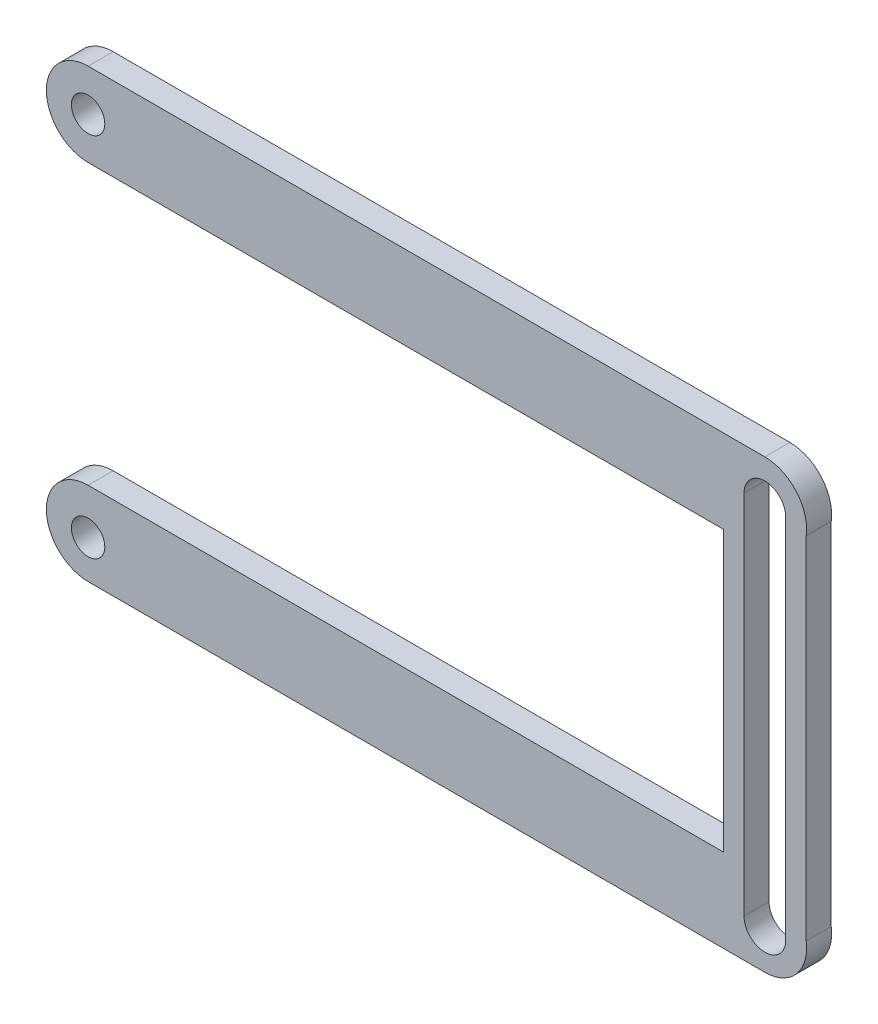
ISO-10303-21;
HEADER;
FILE_DESCRIPTION(('STEP AP214'),'2;1');
FILE_NAME('part.step','',(''),(''),'','','');
FILE_SCHEMA(('AUTOMOTIVE_DESIGN { 1 0 10303 214 1 1 1 1 }'));
ENDSEC;
DATA;
#1=APPLICATION_CONTEXT('core data for automotive mechanical design processes');
#2=APPLICATION_PROTOCOL_DEFINITION('international standard','automotive_design',2000,#1);
#3=PRODUCT_CONTEXT('',#1,'mechanical');
#4=PRODUCT('Part','Part','',(#3));
#5=PRODUCT_RELATED_PRODUCT_CATEGORY('part','',(#4));
#6=PRODUCT_DEFINITION_FORMATION('','',#4);
#7=PRODUCT_DEFINITION_CONTEXT('part definition',#1,'design');
#8=PRODUCT_DEFINITION('design','',#6,#7);
#9=PRODUCT_DEFINITION_SHAPE('','',#8);
#10=(LENGTH_UNIT() NAMED_UNIT(*) SI_UNIT(.MILLI.,.METRE.));
#11=(NAMED_UNIT(*) PLANE_ANGLE_UNIT() SI_UNIT($,.RADIAN.));
#12=(NAMED_UNIT(*) SI_UNIT($,.STERADIAN.) SOLID_ANGLE_UNIT());
#13=UNCERTAINTY_MEASURE_WITH_UNIT(LENGTH_MEASURE(1.E-05),#10,'distance_accuracy_value','');
#14=(GEOMETRIC_REPRESENTATION_CONTEXT(3) GLOBAL_UNCERTAINTY_ASSIGNED_CONTEXT((#13)) GLOBAL_UNIT_ASSIGNED_CONTEXT((#10,
#11,#12)) REPRESENTATION_CONTEXT('',''));
#15=CARTESIAN_POINT('',(0.,0.,0.));
#16=DIRECTION('',(0.,0.,1.));
#17=DIRECTION('',(1.,0.,0.));
#18=AXIS2_PLACEMENT_3D('',#15,#16,#17);
#19=CARTESIAN_POINT('',(0.,14.910133645233,-3.));
#20=DIRECTION('',(0.,-1.,0.));
#21=DIRECTION('',(0.,0.,-1.));
#22=AXIS2_PLACEMENT_3D('',#19,#20,#21);
#23=PLANE('',#22);
#24=DIRECTION('',(1.,0.,0.));
#25=VECTOR('',#24,1.);
#26=CARTESIAN_POINT('',(0.,14.910133645233,0.));
#27=LINE('',#26,#25);
#28=CARTESIAN_POINT('',(-50.3363952262952,14.910133645233,0.));
#29=VERTEX_POINT('',#28);
#30=CARTESIAN_POINT('',(25.802071197867,14.910133645233,0.));
#31=VERTEX_POINT('',#30);
#32=EDGE_CURVE('E240',#29,#31,#27,.T.);
#33=ORIENTED_EDGE('',*,*,#32,.F.);
#34=DIRECTION('',(0.,0.,1.));
#35=VECTOR('',#34,1.);
#36=CARTESIAN_POINT('',(-50.3363952262952,14.910133645233,-3.));
#37=LINE('',#36,#35);
#38=CARTESIAN_POINT('',(-50.3363952262952,14.910133645233,-3.));
#39=VERTEX_POINT('',#38);
#40=EDGE_CURVE('E270',#39,#29,#37,.T.);
#41=ORIENTED_EDGE('',*,*,#40,.F.);
#42=DIRECTION('',(1.,0.,0.));
#43=VECTOR('',#42,1.);
#44=CARTESIAN_POINT('',(0.,14.910133645233,-3.));
#45=LINE('',#44,#43);
#46=CARTESIAN_POINT('',(25.802071197867,14.910133645233,-3.));
#47=VERTEX_POINT('',#46);
#48=EDGE_CURVE('E244',#39,#47,#45,.T.);
#49=ORIENTED_EDGE('',*,*,#48,.T.);
#50=DIRECTION('',(0.,0.,1.));
#51=VECTOR('',#50,1.);
#52=CARTESIAN_POINT('',(25.802071197867,14.910133645233,-3.));
#53=LINE('',#52,#51);
#54=EDGE_CURVE('E263',#47,#31,#53,.T.);
#55=ORIENTED_EDGE('',*,*,#54,.T.);
#56=EDGE_LOOP('',(#33,#41,#49,#55));
#57=FACE_BOUND('',#56,.T.);
#58=ADVANCED_FACE('F99',(#57),#23,.T.);
#59=CARTESIAN_POINT('',(-50.3363952262952,19.910133645233,-3.));
#60=DIRECTION('',(0.,0.,1.));
#61=DIRECTION('',(1.,0.,0.));
#62=AXIS2_PLACEMENT_3D('',#59,#60,#61);
#63=CYLINDRICAL_SURFACE('',#62,5.);
#64=CARTESIAN_POINT('',(-50.3363952262952,19.910133645233,0.));
#65=DIRECTION('',(0.,0.,1.));
#66=DIRECTION('',(1.,0.,0.));
#67=AXIS2_PLACEMENT_3D('',#64,#65,#66);
#68=CIRCLE('',#67,5.);
#69=CARTESIAN_POINT('',(-50.3363952262952,24.910133645233,0.));
#70=VERTEX_POINT('',#69);
#71=EDGE_CURVE('E258',#70,#29,#68,.T.);
#72=ORIENTED_EDGE('',*,*,#71,.F.);
#73=DIRECTION('',(0.,0.,1.));
#74=VECTOR('',#73,1.);
#75=CARTESIAN_POINT('',(-50.3363952262952,24.910133645233,-3.));
#76=LINE('',#75,#74);
#77=CARTESIAN_POINT('',(-50.3363952262952,24.910133645233,-3.));
#78=VERTEX_POINT('',#77);
#79=EDGE_CURVE('E267',#78,#70,#76,.T.);
#80=ORIENTED_EDGE('',*,*,#79,.F.);
#81=CARTESIAN_POINT('',(-50.3363952262952,19.910133645233,-3.));
#82=DIRECTION('',(0.,0.,1.));
#83=DIRECTION('',(1.,0.,0.));
#84=AXIS2_PLACEMENT_3D('',#81,#82,#83);
#85=CIRCLE('',#84,5.);
#86=EDGE_CURVE('E245',#78,#39,#85,.T.);
#87=ORIENTED_EDGE('',*,*,#86,.T.);
#88=ORIENTED_EDGE('',*,*,#40,.T.);
#89=EDGE_LOOP('',(#72,#80,#87,#88));
#90=FACE_BOUND('',#89,.T.);
#91=ADVANCED_FACE('F362',(#90),#63,.T.);
#92=CARTESIAN_POINT('',(0.,24.910133645233,-3.));
#93=DIRECTION('',(0.,-1.,0.));
#94=DIRECTION('',(0.,0.,-1.));
#95=AXIS2_PLACEMENT_3D('',#92,#93,#94);
#96=PLANE('',#95);
#97=DIRECTION('',(1.,0.,0.));
#98=VECTOR('',#97,1.);
#99=CARTESIAN_POINT('',(0.,24.910133645233,0.));
#100=LINE('',#99,#98);
#101=CARTESIAN_POINT('',(30.7502492238458,24.910133645233,0.));
#102=VERTEX_POINT('',#101);
#103=EDGE_CURVE('E259',#70,#102,#100,.T.);
#104=ORIENTED_EDGE('',*,*,#103,.T.);
#105=DIRECTION('',(0.,0.,1.));
#106=VECTOR('',#105,1.);
#107=CARTESIAN_POINT('',(30.7502492238458,24.910133645233,-3.));
#108=LINE('',#107,#106);
#109=CARTESIAN_POINT('',(30.7502492238458,24.910133645233,-3.));
#110=VERTEX_POINT('',#109);
#111=EDGE_CURVE('E272',#110,#102,#108,.T.);
#112=ORIENTED_EDGE('',*,*,#111,.F.);
#113=DIRECTION('',(1.,0.,0.));
#114=VECTOR('',#113,1.);
#115=CARTESIAN_POINT('',(0.,24.910133645233,-3.));
#116=LINE('',#115,#114);
#117=EDGE_CURVE('E239',#78,#110,#116,.T.);
#118=ORIENTED_EDGE('',*,*,#117,.F.);
#119=ORIENTED_EDGE('',*,*,#79,.T.);
#120=EDGE_LOOP('',(#104,#112,#118,#119));
#121=FACE_BOUND('',#120,.T.);
#122=ADVANCED_FACE('F371',(#121),#96,.F.);
#123=CARTESIAN_POINT('',(30.7502492238458,19.910133645233,-3.));
#124=DIRECTION('',(0.,0.,1.));
#125=DIRECTION('',(1.,0.,0.));
#126=AXIS2_PLACEMENT_3D('',#123,#124,#125);
#127=CYLINDRICAL_SURFACE('',#126,5.);
#128=CARTESIAN_POINT('',(30.7502492238458,19.910133645233,0.));
#129=DIRECTION('',(0.,0.,1.));
#130=DIRECTION('',(1.,0.,0.));
#131=AXIS2_PLACEMENT_3D('',#128,#129,#130);
#132=CIRCLE('',#131,5.);
#133=CARTESIAN_POINT('',(35.6984272498246,19.192126526034,0.));
#134=VERTEX_POINT('',#133);
#135=EDGE_CURVE('E255',#134,#102,#132,.T.);
#136=ORIENTED_EDGE('',*,*,#135,.F.);
#137=DIRECTION('',(0.,0.,1.));
#138=VECTOR('',#137,1.);
#139=CARTESIAN_POINT('',(35.6984272498246,19.192126526034,-3.));
#140=LINE('',#139,#138);
#141=CARTESIAN_POINT('',(35.6984272498246,19.192126526034,-3.));
#142=VERTEX_POINT('',#141);
#143=EDGE_CURVE('E247',#142,#134,#140,.T.);
#144=ORIENTED_EDGE('',*,*,#143,.F.);
#145=CARTESIAN_POINT('',(30.7502492238458,19.910133645233,-3.));
#146=DIRECTION('',(0.,0.,1.));
#147=DIRECTION('',(1.,0.,0.));
#148=AXIS2_PLACEMENT_3D('',#145,#146,#147);
#149=CIRCLE('',#148,5.);
#150=EDGE_CURVE('E236',#142,#110,#149,.T.);
#151=ORIENTED_EDGE('',*,*,#150,.T.);
#152=ORIENTED_EDGE('',*,*,#111,.T.);
#153=EDGE_LOOP('',(#136,#144,#151,#152));
#154=FACE_BOUND('',#153,.T.);
#155=ADVANCED_FACE('F378',(#154),#127,.T.);
#156=CARTESIAN_POINT('',(-50.3363952262952,19.910133645233,-3.));
#157=DIRECTION('',(0.,0.,1.));
#158=DIRECTION('',(1.,0.,0.));
#159=AXIS2_PLACEMENT_3D('',#156,#157,#158);
#160=CYLINDRICAL_SURFACE('',#159,2.);
#161=CARTESIAN_POINT('',(-50.3363952262952,19.910133645233,-3.));
#162=DIRECTION('',(0.,0.,1.));
#163=DIRECTION('',(1.,0.,0.));
#164=AXIS2_PLACEMENT_3D('',#161,#162,#163);
#165=CIRCLE('',#164,2.);
#166=CARTESIAN_POINT('',(-48.3363952262952,19.910133645233,-3.));
#167=VERTEX_POINT('',#166);
#168=EDGE_CURVE('E231',#167,#167,#165,.T.);
#169=ORIENTED_EDGE('',*,*,#168,.F.);
#170=EDGE_LOOP('',(#169));
#171=FACE_BOUND('',#170,.T.);
#172=CARTESIAN_POINT('',(-50.3363952262952,19.910133645233,0.));
#173=DIRECTION('',(0.,0.,1.));
#174=DIRECTION('',(1.,0.,0.));
#175=AXIS2_PLACEMENT_3D('',#172,#173,#174);
#176=CIRCLE('',#175,2.);
#177=CARTESIAN_POINT('',(-48.3363952262952,19.910133645233,0.));
#178=VERTEX_POINT('',#177);
#179=EDGE_CURVE('E248',#178,#178,#176,.T.);
#180=ORIENTED_EDGE('',*,*,#179,.T.);
#181=EDGE_LOOP('',(#180));
#182=FACE_BOUND('',#181,.T.);
#183=ADVANCED_FACE('F384',(#171,#182),#160,.F.);
#184=CARTESIAN_POINT('',(0.,0.,0.));
#185=DIRECTION('',(0.,0.,1.));
#186=DIRECTION('',(1.,0.,0.));
#187=AXIS2_PLACEMENT_3D('',#184,#185,#186);
#188=PLANE('',#187);
#189=CARTESIAN_POINT('',(30.7502492238458,19.910133645233,0.));
#190=DIRECTION('',(0.,0.,1.));
#191=DIRECTION('',(1.,0.,0.));
#192=AXIS2_PLACEMENT_3D('',#189,#190,#191);
#193=CIRCLE('',#192,2.49817802597881);
#194=CARTESIAN_POINT('',(33.2484272498246,19.910133645233,0.));
#195=VERTEX_POINT('',#194);
#196=CARTESIAN_POINT('',(28.252071197867,19.910133645233,0.));
#197=VERTEX_POINT('',#196);
#198=EDGE_CURVE('E114',#195,#197,#193,.T.);
#199=ORIENTED_EDGE('',*,*,#198,.F.);
#200=DIRECTION('',(0.,-1.,0.));
#201=VECTOR('',#200,1.);
#202=CARTESIAN_POINT('',(33.2484272498246,19.910133645233,0.));
#203=LINE('',#202,#201);
#204=CARTESIAN_POINT('',(33.2484272498246,-23.9914631118977,0.));
#205=VERTEX_POINT('',#204);
#206=EDGE_CURVE('E219',#195,#205,#203,.T.);
#207=ORIENTED_EDGE('',*,*,#206,.T.);
#208=CARTESIAN_POINT('',(30.7502492238458,-23.9914631118977,0.));
#209=DIRECTION('',(0.,0.,1.));
#210=DIRECTION('',(1.,0.,0.));
#211=AXIS2_PLACEMENT_3D('',#208,#209,#210);
#212=CIRCLE('',#211,2.49817802597881);
#213=CARTESIAN_POINT('',(28.252071197867,-23.9914631118977,0.));
#214=VERTEX_POINT('',#213);
#215=EDGE_CURVE('E202',#214,#205,#212,.T.);
#216=ORIENTED_EDGE('',*,*,#215,.F.);
#217=DIRECTION('',(0.,-1.,0.));
#218=VECTOR('',#217,1.);
#219=CARTESIAN_POINT('',(28.252071197867,19.910133645233,0.));
#220=LINE('',#219,#218);
#221=EDGE_CURVE('E215',#197,#214,#220,.T.);
#222=ORIENTED_EDGE('',*,*,#221,.F.);
#223=EDGE_LOOP('',(#199,#207,#216,#222));
#224=FACE_BOUND('',#223,.T.);
#225=CARTESIAN_POINT('',(-50.3363952262952,-23.9914631118977,0.));
#226=DIRECTION('',(0.,0.,1.));
#227=DIRECTION('',(1.,0.,0.));
#228=AXIS2_PLACEMENT_3D('',#225,#226,#227);
#229=CIRCLE('',#228,2.);
#230=CARTESIAN_POINT('',(-48.3363952262952,-23.9914631118977,0.));
#231=VERTEX_POINT('',#230);
#232=EDGE_CURVE('E227',#231,#231,#229,.T.);
#233=ORIENTED_EDGE('',*,*,#232,.F.);
#234=EDGE_LOOP('',(#233));
#235=FACE_BOUND('',#234,.T.);
#236=DIRECTION('',(0.,-1.,0.));
#237=VECTOR('',#236,1.);
#238=CARTESIAN_POINT('',(35.6984272498246,19.910133645233,0.));
#239=LINE('',#238,#237);
#240=CARTESIAN_POINT('',(35.6984272498246,-22.8570733444997,0.));
#241=VERTEX_POINT('',#240);
#242=EDGE_CURVE('E308',#134,#241,#239,.T.);
#243=ORIENTED_EDGE('',*,*,#242,.F.);
#244=ORIENTED_EDGE('',*,*,#135,.T.);
#245=ORIENTED_EDGE('',*,*,#103,.F.);
#246=ORIENTED_EDGE('',*,*,#71,.T.);
#247=ORIENTED_EDGE('',*,*,#32,.T.);
#248=DIRECTION('',(0.,-1.,0.));
#249=VECTOR('',#248,1.);
#250=CARTESIAN_POINT('',(25.802071197867,19.910133645233,0.));
#251=LINE('',#250,#249);
#252=CARTESIAN_POINT('',(25.802071197867,-18.5750804636988,0.));
#253=VERTEX_POINT('',#252);
#254=EDGE_CURVE('E309',#31,#253,#251,.T.);
#255=ORIENTED_EDGE('',*,*,#254,.T.);
#256=DIRECTION('',(1.,0.,0.));
#257=VECTOR('',#256,1.);
#258=CARTESIAN_POINT('',(-50.3363952262952,-18.5750804636988,0.));
#259=LINE('',#258,#257);
#260=CARTESIAN_POINT('',(-50.3363952262952,-18.5750804636988,0.));
#261=VERTEX_POINT('',#260);
#262=EDGE_CURVE('E280',#261,#253,#259,.T.);
#263=ORIENTED_EDGE('',*,*,#262,.F.);
#264=CARTESIAN_POINT('',(-50.3363952262952,-23.5750804636988,0.));
#265=DIRECTION('',(0.,0.,1.));
#266=DIRECTION('',(1.,0.,0.));
#267=AXIS2_PLACEMENT_3D('',#264,#265,#266);
#268=CIRCLE('',#267,5.);
#269=CARTESIAN_POINT('',(-50.3363952262952,-28.5750804636988,0.));
#270=VERTEX_POINT('',#269);
#271=EDGE_CURVE('E288',#261,#270,#268,.T.);
#272=ORIENTED_EDGE('',*,*,#271,.T.);
#273=DIRECTION('',(1.,0.,0.));
#274=VECTOR('',#273,1.);
#275=CARTESIAN_POINT('',(-50.3363952262952,-28.5750804636988,0.));
#276=LINE('',#275,#274);
#277=CARTESIAN_POINT('',(30.7502492238458,-28.5750804636988,0.));
#278=VERTEX_POINT('',#277);
#279=EDGE_CURVE('E293',#270,#278,#276,.T.);
#280=ORIENTED_EDGE('',*,*,#279,.T.);
#281=CARTESIAN_POINT('',(30.7502492238458,-23.5750804636988,0.));
#282=DIRECTION('',(0.,0.,1.));
#283=DIRECTION('',(1.,0.,0.));
#284=AXIS2_PLACEMENT_3D('',#281,#282,#283);
#285=CIRCLE('',#284,5.);
#286=EDGE_CURVE('E294',#278,#241,#285,.T.);
#287=ORIENTED_EDGE('',*,*,#286,.T.);
#288=EDGE_LOOP('',(#243,#244,#245,#246,#247,#255,#263,#272,#280,#287));
#289=FACE_BOUND('',#288,.T.);
#290=ORIENTED_EDGE('',*,*,#179,.F.);
#291=EDGE_LOOP('',(#290));
#292=FACE_BOUND('',#291,.T.);
#293=ADVANCED_FACE('F220',(#224,#235,#289,#292),#188,.T.);
#294=CARTESIAN_POINT('',(0.,0.,-3.));
#295=DIRECTION('',(0.,0.,1.));
#296=DIRECTION('',(1.,0.,0.));
#297=AXIS2_PLACEMENT_3D('',#294,#295,#296);
#298=PLANE('',#297);
#299=DIRECTION('',(0.,-1.,0.));
#300=VECTOR('',#299,1.);
#301=CARTESIAN_POINT('',(33.2484272498246,0.,-3.));
#302=LINE('',#301,#300);
#303=CARTESIAN_POINT('',(33.2484272498246,19.910133645233,-3.));
#304=VERTEX_POINT('',#303);
#305=CARTESIAN_POINT('',(33.2484272498246,-23.9914631118977,-3.));
#306=VERTEX_POINT('',#305);
#307=EDGE_CURVE('E108',#304,#306,#302,.T.);
#308=ORIENTED_EDGE('',*,*,#307,.F.);
#309=CARTESIAN_POINT('',(30.7502492238458,19.910133645233,-3.));
#310=DIRECTION('',(0.,0.,1.));
#311=DIRECTION('',(1.,0.,0.));
#312=AXIS2_PLACEMENT_3D('',#309,#310,#311);
#313=CIRCLE('',#312,2.49817802597881);
#314=CARTESIAN_POINT('',(28.252071197867,19.910133645233,-3.));
#315=VERTEX_POINT('',#314);
#316=EDGE_CURVE('E12',#304,#315,#313,.T.);
#317=ORIENTED_EDGE('',*,*,#316,.T.);
#318=DIRECTION('',(0.,-1.,0.));
#319=VECTOR('',#318,1.);
#320=CARTESIAN_POINT('',(28.252071197867,0.,-3.));
#321=LINE('',#320,#319);
#322=CARTESIAN_POINT('',(28.252071197867,-23.9914631118977,-3.));
#323=VERTEX_POINT('',#322);
#324=EDGE_CURVE('E266',#315,#323,#321,.T.);
#325=ORIENTED_EDGE('',*,*,#324,.T.);
#326=CARTESIAN_POINT('',(30.7502492238458,-23.9914631118977,-3.));
#327=DIRECTION('',(0.,0.,1.));
#328=DIRECTION('',(1.,0.,0.));
#329=AXIS2_PLACEMENT_3D('',#326,#327,#328);
#330=CIRCLE('',#329,2.49817802597881);
#331=EDGE_CURVE('E210',#323,#306,#330,.T.);
#332=ORIENTED_EDGE('',*,*,#331,.T.);
#333=EDGE_LOOP('',(#308,#317,#325,#332));
#334=FACE_BOUND('',#333,.T.);
#335=CARTESIAN_POINT('',(-50.3363952262952,-23.9914631118977,-3.));
#336=DIRECTION('',(0.,0.,1.));
#337=DIRECTION('',(1.,0.,0.));
#338=AXIS2_PLACEMENT_3D('',#335,#336,#337);
#339=CIRCLE('',#338,2.);
#340=CARTESIAN_POINT('',(-48.3363952262952,-23.9914631118977,-3.));
#341=VERTEX_POINT('',#340);
#342=EDGE_CURVE('E235',#341,#341,#339,.T.);
#343=ORIENTED_EDGE('',*,*,#342,.T.);
#344=EDGE_LOOP('',(#343));
#345=FACE_BOUND('',#344,.T.);
#346=ORIENTED_EDGE('',*,*,#150,.F.);
#347=DIRECTION('',(0.,-1.,0.));
#348=VECTOR('',#347,1.);
#349=CARTESIAN_POINT('',(35.6984272498246,19.910133645233,-3.));
#350=LINE('',#349,#348);
#351=CARTESIAN_POINT('',(35.6984272498246,-22.8570733444997,-3.));
#352=VERTEX_POINT('',#351);
#353=EDGE_CURVE('E292',#142,#352,#350,.T.);
#354=ORIENTED_EDGE('',*,*,#353,.T.);
#355=CARTESIAN_POINT('',(30.7502492238458,-23.5750804636988,-3.));
#356=DIRECTION('',(0.,0.,1.));
#357=DIRECTION('',(1.,0.,0.));
#358=AXIS2_PLACEMENT_3D('',#355,#356,#357);
#359=CIRCLE('',#358,5.);
#360=CARTESIAN_POINT('',(30.7502492238458,-28.5750804636988,-3.));
#361=VERTEX_POINT('',#360);
#362=EDGE_CURVE('E281',#361,#352,#359,.T.);
#363=ORIENTED_EDGE('',*,*,#362,.F.);
#364=DIRECTION('',(1.,0.,0.));
#365=VECTOR('',#364,1.);
#366=CARTESIAN_POINT('',(-50.3363952262952,-28.5750804636988,-3.));
#367=LINE('',#366,#365);
#368=CARTESIAN_POINT('',(-50.3363952262952,-28.5750804636988,-3.));
#369=VERTEX_POINT('',#368);
#370=EDGE_CURVE('E276',#369,#361,#367,.T.);
#371=ORIENTED_EDGE('',*,*,#370,.F.);
#372=CARTESIAN_POINT('',(-50.3363952262952,-23.5750804636988,-3.));
#373=DIRECTION('',(0.,0.,1.));
#374=DIRECTION('',(1.,0.,0.));
#375=AXIS2_PLACEMENT_3D('',#372,#373,#374);
#376=CIRCLE('',#375,5.);
#377=CARTESIAN_POINT('',(-50.3363952262952,-18.5750804636988,-3.));
#378=VERTEX_POINT('',#377);
#379=EDGE_CURVE('E274',#378,#369,#376,.T.);
#380=ORIENTED_EDGE('',*,*,#379,.F.);
#381=DIRECTION('',(1.,0.,0.));
#382=VECTOR('',#381,1.);
#383=CARTESIAN_POINT('',(-50.3363952262952,-18.5750804636988,-3.));
#384=LINE('',#383,#382);
#385=CARTESIAN_POINT('',(25.802071197867,-18.5750804636988,-3.));
#386=VERTEX_POINT('',#385);
#387=EDGE_CURVE('E283',#378,#386,#384,.T.);
#388=ORIENTED_EDGE('',*,*,#387,.T.);
#389=DIRECTION('',(0.,-1.,0.));
#390=VECTOR('',#389,1.);
#391=CARTESIAN_POINT('',(25.802071197867,19.910133645233,-3.));
#392=LINE('',#391,#390);
#393=EDGE_CURVE('E306',#47,#386,#392,.T.);
#394=ORIENTED_EDGE('',*,*,#393,.F.);
#395=ORIENTED_EDGE('',*,*,#48,.F.);
#396=ORIENTED_EDGE('',*,*,#86,.F.);
#397=ORIENTED_EDGE('',*,*,#117,.T.);
#398=EDGE_LOOP('',(#346,#354,#363,#371,#380,#388,#394,#395,#396,#397));
#399=FACE_BOUND('',#398,.T.);
#400=ORIENTED_EDGE('',*,*,#168,.T.);
#401=EDGE_LOOP('',(#400));
#402=FACE_BOUND('',#401,.T.);
#403=ADVANCED_FACE('F322',(#334,#345,#399,#402),#298,.F.);
#404=CARTESIAN_POINT('',(-50.3363952262952,-23.5750804636988,-3.));
#405=DIRECTION('',(0.,0.,1.));
#406=DIRECTION('',(1.,0.,0.));
#407=AXIS2_PLACEMENT_3D('',#404,#405,#406);
#408=CYLINDRICAL_SURFACE('',#407,5.);
#409=ORIENTED_EDGE('',*,*,#271,.F.);
#410=DIRECTION('',(0.,0.,1.));
#411=VECTOR('',#410,1.);
#412=CARTESIAN_POINT('',(-50.3363952262952,-18.5750804636988,-3.));
#413=LINE('',#412,#411);
#414=EDGE_CURVE('E297',#378,#261,#413,.T.);
#415=ORIENTED_EDGE('',*,*,#414,.F.);
#416=ORIENTED_EDGE('',*,*,#379,.T.);
#417=DIRECTION('',(0.,0.,1.));
#418=VECTOR('',#417,1.);
#419=CARTESIAN_POINT('',(-50.3363952262952,-28.5750804636988,-3.));
#420=LINE('',#419,#418);
#421=EDGE_CURVE('E290',#369,#270,#420,.T.);
#422=ORIENTED_EDGE('',*,*,#421,.T.);
#423=EDGE_LOOP('',(#409,#415,#416,#422));
#424=FACE_BOUND('',#423,.T.);
#425=ADVANCED_FACE('F344',(#424),#408,.T.);
#426=CARTESIAN_POINT('',(-50.3363952262952,-28.5750804636988,-3.));
#427=DIRECTION('',(0.,-1.,0.));
#428=DIRECTION('',(0.,0.,-1.));
#429=AXIS2_PLACEMENT_3D('',#426,#427,#428);
#430=PLANE('',#429);
#431=ORIENTED_EDGE('',*,*,#279,.F.);
#432=ORIENTED_EDGE('',*,*,#421,.F.);
#433=ORIENTED_EDGE('',*,*,#370,.T.);
#434=DIRECTION('',(0.,0.,1.));
#435=VECTOR('',#434,1.);
#436=CARTESIAN_POINT('',(30.7502492238458,-28.5750804636988,-3.));
#437=LINE('',#436,#435);
#438=EDGE_CURVE('E303',#361,#278,#437,.T.);
#439=ORIENTED_EDGE('',*,*,#438,.T.);
#440=EDGE_LOOP('',(#431,#432,#433,#439));
#441=FACE_BOUND('',#440,.T.);
#442=ADVANCED_FACE('F345',(#441),#430,.T.);
#443=CARTESIAN_POINT('',(-50.3363952262952,-18.5750804636988,-3.));
#444=DIRECTION('',(0.,-1.,0.));
#445=DIRECTION('',(0.,0.,-1.));
#446=AXIS2_PLACEMENT_3D('',#443,#444,#445);
#447=PLANE('',#446);
#448=ORIENTED_EDGE('',*,*,#262,.T.);
#449=DIRECTION('',(0.,0.,-1.));
#450=VECTOR('',#449,1.);
#451=CARTESIAN_POINT('',(25.802071197867,-18.5750804636988,-3.));
#452=LINE('',#451,#450);
#453=EDGE_CURVE('E254',#253,#386,#452,.T.);
#454=ORIENTED_EDGE('',*,*,#453,.T.);
#455=ORIENTED_EDGE('',*,*,#387,.F.);
#456=ORIENTED_EDGE('',*,*,#414,.T.);
#457=EDGE_LOOP('',(#448,#454,#455,#456));
#458=FACE_BOUND('',#457,.T.);
#459=ADVANCED_FACE('F349',(#458),#447,.F.);
#460=CARTESIAN_POINT('',(30.7502492238458,-23.5750804636988,-3.));
#461=DIRECTION('',(0.,0.,1.));
#462=DIRECTION('',(1.,0.,0.));
#463=AXIS2_PLACEMENT_3D('',#460,#461,#462);
#464=CYLINDRICAL_SURFACE('',#463,5.);
#465=ORIENTED_EDGE('',*,*,#362,.T.);
#466=DIRECTION('',(0.,0.,1.));
#467=VECTOR('',#466,1.);
#468=CARTESIAN_POINT('',(35.6984272498246,-22.8570733444998,-3.));
#469=LINE('',#468,#467);
#470=EDGE_CURVE('E305',#352,#241,#469,.T.);
#471=ORIENTED_EDGE('',*,*,#470,.T.);
#472=ORIENTED_EDGE('',*,*,#286,.F.);
#473=ORIENTED_EDGE('',*,*,#438,.F.);
#474=EDGE_LOOP('',(#465,#471,#472,#473));
#475=FACE_BOUND('',#474,.T.);
#476=ADVANCED_FACE('F363',(#475),#464,.T.);
#477=CARTESIAN_POINT('',(25.802071197867,19.910133645233,-3.));
#478=DIRECTION('',(-1.,0.,0.));
#479=DIRECTION('',(0.,-1.,0.));
#480=AXIS2_PLACEMENT_3D('',#477,#478,#479);
#481=PLANE('',#480);
#482=ORIENTED_EDGE('',*,*,#254,.F.);
#483=ORIENTED_EDGE('',*,*,#54,.F.);
#484=ORIENTED_EDGE('',*,*,#393,.T.);
#485=ORIENTED_EDGE('',*,*,#453,.F.);
#486=EDGE_LOOP('',(#482,#483,#484,#485));
#487=FACE_BOUND('',#486,.T.);
#488=ADVANCED_FACE('F105',(#487),#481,.T.);
#489=CARTESIAN_POINT('',(35.6984272498246,19.910133645233,-3.));
#490=DIRECTION('',(-1.,0.,0.));
#491=DIRECTION('',(0.,-1.,0.));
#492=AXIS2_PLACEMENT_3D('',#489,#490,#491);
#493=PLANE('',#492);
#494=ORIENTED_EDGE('',*,*,#353,.F.);
#495=ORIENTED_EDGE('',*,*,#143,.T.);
#496=ORIENTED_EDGE('',*,*,#242,.T.);
#497=ORIENTED_EDGE('',*,*,#470,.F.);
#498=EDGE_LOOP('',(#494,#495,#496,#497));
#499=FACE_BOUND('',#498,.T.);
#500=ADVANCED_FACE('F340',(#499),#493,.F.);
#501=CARTESIAN_POINT('',(-50.3363952262952,-23.9914631118977,-6.));
#502=DIRECTION('',(0.,0.,1.));
#503=DIRECTION('',(1.,0.,0.));
#504=AXIS2_PLACEMENT_3D('',#501,#502,#503);
#505=CYLINDRICAL_SURFACE('',#504,2.);
#506=ORIENTED_EDGE('',*,*,#232,.T.);
#507=EDGE_LOOP('',(#506));
#508=FACE_BOUND('',#507,.T.);
#509=ORIENTED_EDGE('',*,*,#342,.F.);
#510=EDGE_LOOP('',(#509));
#511=FACE_BOUND('',#510,.T.);
#512=ADVANCED_FACE('F328',(#508,#511),#505,.F.);
#513=CARTESIAN_POINT('',(30.7502492238458,19.910133645233,-6.));
#514=DIRECTION('',(0.,0.,1.));
#515=DIRECTION('',(1.,0.,0.));
#516=AXIS2_PLACEMENT_3D('',#513,#514,#515);
#517=CYLINDRICAL_SURFACE('',#516,2.49817802597881);
#518=DIRECTION('',(0.,0.,1.));
#519=VECTOR('',#518,1.);
#520=CARTESIAN_POINT('',(33.2484272498246,19.910133645233,-6.));
#521=LINE('',#520,#519);
#522=EDGE_CURVE('E224',#304,#195,#521,.T.);
#523=ORIENTED_EDGE('',*,*,#522,.T.);
#524=ORIENTED_EDGE('',*,*,#198,.T.);
#525=DIRECTION('',(0.,0.,1.));
#526=VECTOR('',#525,1.);
#527=CARTESIAN_POINT('',(28.252071197867,19.910133645233,-6.));
#528=LINE('',#527,#526);
#529=EDGE_CURVE('E208',#315,#197,#528,.T.);
#530=ORIENTED_EDGE('',*,*,#529,.F.);
#531=ORIENTED_EDGE('',*,*,#316,.F.);
#532=EDGE_LOOP('',(#523,#524,#530,#531));
#533=FACE_BOUND('',#532,.T.);
#534=ADVANCED_FACE('F330',(#533),#517,.F.);
#535=CARTESIAN_POINT('',(33.2484272498246,19.910133645233,-6.));
#536=DIRECTION('',(-1.,0.,0.));
#537=DIRECTION('',(0.,-1.,0.));
#538=AXIS2_PLACEMENT_3D('',#535,#536,#537);
#539=PLANE('',#538);
#540=ORIENTED_EDGE('',*,*,#307,.T.);
#541=DIRECTION('',(0.,0.,1.));
#542=VECTOR('',#541,1.);
#543=CARTESIAN_POINT('',(33.2484272498246,-23.9914631118977,-6.));
#544=LINE('',#543,#542);
#545=EDGE_CURVE('E209',#306,#205,#544,.T.);
#546=ORIENTED_EDGE('',*,*,#545,.T.);
#547=ORIENTED_EDGE('',*,*,#206,.F.);
#548=ORIENTED_EDGE('',*,*,#522,.F.);
#549=EDGE_LOOP('',(#540,#546,#547,#548));
#550=FACE_BOUND('',#549,.T.);
#551=ADVANCED_FACE('F325',(#550),#539,.T.);
#552=CARTESIAN_POINT('',(30.7502492238458,-23.9914631118977,-6.));
#553=DIRECTION('',(0.,0.,1.));
#554=DIRECTION('',(1.,0.,0.));
#555=AXIS2_PLACEMENT_3D('',#552,#553,#554);
#556=CYLINDRICAL_SURFACE('',#555,2.49817802597881);
#557=DIRECTION('',(0.,0.,1.));
#558=VECTOR('',#557,1.);
#559=CARTESIAN_POINT('',(28.252071197867,-23.9914631118977,-6.));
#560=LINE('',#559,#558);
#561=EDGE_CURVE('E124',#323,#214,#560,.T.);
#562=ORIENTED_EDGE('',*,*,#561,.T.);
#563=ORIENTED_EDGE('',*,*,#215,.T.);
#564=ORIENTED_EDGE('',*,*,#545,.F.);
#565=ORIENTED_EDGE('',*,*,#331,.F.);
#566=EDGE_LOOP('',(#562,#563,#564,#565));
#567=FACE_BOUND('',#566,.T.);
#568=ADVANCED_FACE('F201',(#567),#556,.F.);
#569=CARTESIAN_POINT('',(28.252071197867,19.910133645233,-6.));
#570=DIRECTION('',(-1.,0.,0.));
#571=DIRECTION('',(0.,-1.,0.));
#572=AXIS2_PLACEMENT_3D('',#569,#570,#571);
#573=PLANE('',#572);
#574=ORIENTED_EDGE('',*,*,#529,.T.);
#575=ORIENTED_EDGE('',*,*,#221,.T.);
#576=ORIENTED_EDGE('',*,*,#561,.F.);
#577=ORIENTED_EDGE('',*,*,#324,.F.);
#578=EDGE_LOOP('',(#574,#575,#576,#577));
#579=FACE_BOUND('',#578,.T.);
#580=ADVANCED_FACE('F213',(#579),#573,.F.);
#581=CLOSED_SHELL('',(#58,#91,#122,#155,#183,#293,#403,#425,#442,#459,#476,#488,#500,#512,#534,
#551,#568,#580));
#582=MANIFOLD_SOLID_BREP('B2',#581);
#583=ADVANCED_BREP_SHAPE_REPRESENTATION('',(#18,#582),#14);
#584=SHAPE_DEFINITION_REPRESENTATION(#9,#583);
ENDSEC;
END-ISO-10303-21;
